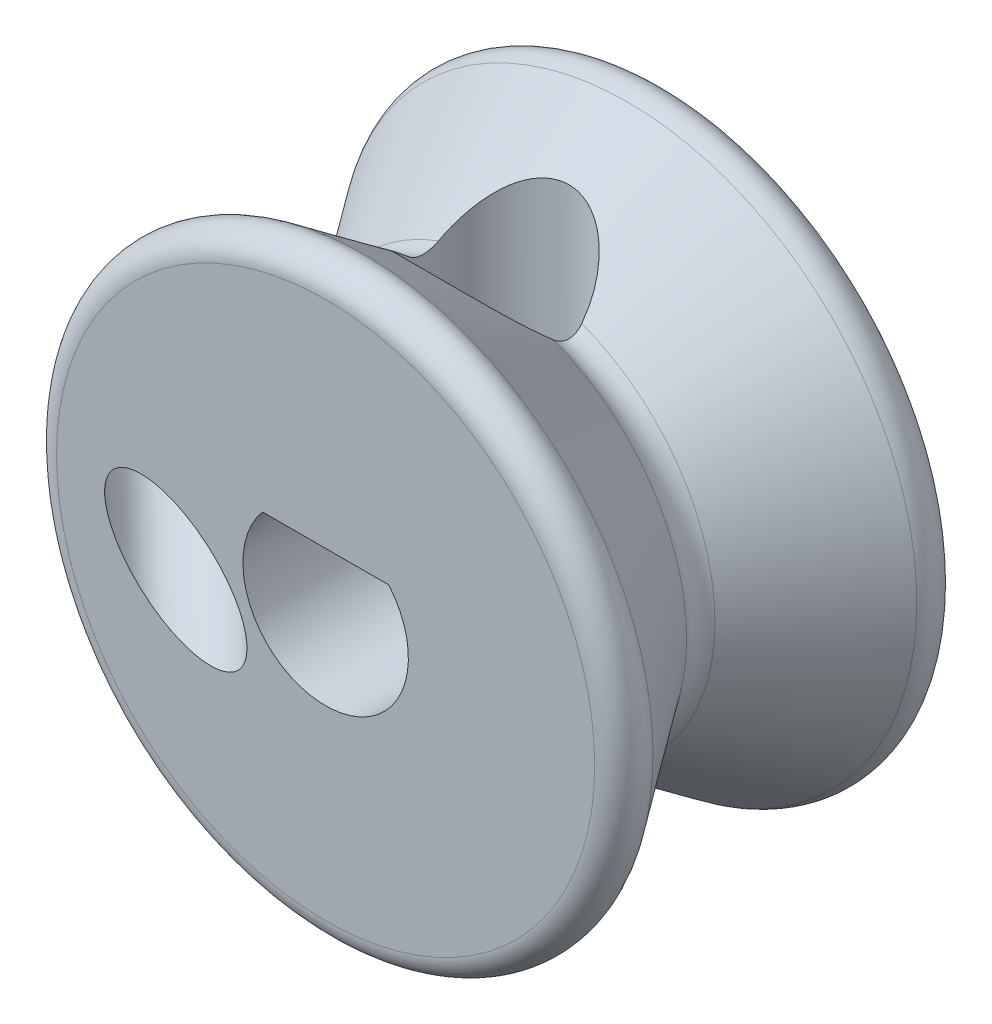
ISO-10303-21;
HEADER;
FILE_DESCRIPTION(('STEP AP214'),'2;1');
FILE_NAME('part.step','',(''),(''),'','','');
FILE_SCHEMA(('AUTOMOTIVE_DESIGN { 1 0 10303 214 1 1 1 1 }'));
ENDSEC;
DATA;
#1=APPLICATION_CONTEXT('core data for automotive mechanical design processes');
#2=APPLICATION_PROTOCOL_DEFINITION('international standard','automotive_design',2000,#1);
#3=PRODUCT_CONTEXT('',#1,'mechanical');
#4=PRODUCT('Part','Part','',(#3));
#5=PRODUCT_RELATED_PRODUCT_CATEGORY('part','',(#4));
#6=PRODUCT_DEFINITION_FORMATION('','',#4);
#7=PRODUCT_DEFINITION_CONTEXT('part definition',#1,'design');
#8=PRODUCT_DEFINITION('design','',#6,#7);
#9=PRODUCT_DEFINITION_SHAPE('','',#8);
#10=(LENGTH_UNIT() NAMED_UNIT(*) SI_UNIT(.MILLI.,.METRE.));
#11=(NAMED_UNIT(*) PLANE_ANGLE_UNIT() SI_UNIT($,.RADIAN.));
#12=(NAMED_UNIT(*) SI_UNIT($,.STERADIAN.) SOLID_ANGLE_UNIT());
#13=UNCERTAINTY_MEASURE_WITH_UNIT(LENGTH_MEASURE(1.E-05),#10,'distance_accuracy_value','');
#14=(GEOMETRIC_REPRESENTATION_CONTEXT(3) GLOBAL_UNCERTAINTY_ASSIGNED_CONTEXT((#13)) GLOBAL_UNIT_ASSIGNED_CONTEXT((#10,
#11,#12)) REPRESENTATION_CONTEXT('',''));
#15=CARTESIAN_POINT('',(0.,0.,0.));
#16=DIRECTION('',(0.,0.,1.));
#17=DIRECTION('',(1.,0.,0.));
#18=AXIS2_PLACEMENT_3D('',#15,#16,#17);
#19=CARTESIAN_POINT('',(0.,0.,-3.20938090314045));
#20=DIRECTION('',(0.,0.,1.));
#21=DIRECTION('',(1.,0.,0.));
#22=AXIS2_PLACEMENT_3D('',#19,#20,#21);
#23=CONICAL_SURFACE('',#22,4.20758506918539,0.620249485982821);
#24=CARTESIAN_POINT('',(-5.02656954580131,-0.227958123195677,-2.055569720891));
#25=CARTESIAN_POINT('',(-4.99379305476012,-0.21155060466564,-2.102451352586));
#26=CARTESIAN_POINT('',(-4.96203208182432,-0.189550428061586,-2.14818223013721));
#27=CARTESIAN_POINT('',(-4.90114036581584,-0.136146671985123,-2.23584987784017));
#28=CARTESIAN_POINT('',(-4.87201894340157,-0.104711340412993,-2.27777320391632));
#29=CARTESIAN_POINT('',(-4.81683589423341,-0.0344840006915252,-2.35643027532819));
#30=CARTESIAN_POINT('',(-4.790751746197,0.00424742477340337,-2.39320269166795));
#31=CARTESIAN_POINT('',(-4.74135798028501,0.0877574922217572,-2.46122207843588));
#32=CARTESIAN_POINT('',(-4.71804692125338,0.132532967095702,-2.49247192304468));
#33=CARTESIAN_POINT('',(-4.67091881420649,0.233836645937845,-2.55297597588142));
#34=CARTESIAN_POINT('',(-4.64751892760425,0.291127509368169,-2.58128305548753));
#35=CARTESIAN_POINT('',(-4.60427350990293,0.410598163993671,-2.62900404687573));
#36=CARTESIAN_POINT('',(-4.58443060640138,0.472781520954569,-2.64841140065061));
#37=CARTESIAN_POINT('',(-4.547532748472,0.604277882200499,-2.67822523843836));
#38=CARTESIAN_POINT('',(-4.53071137851703,0.67379507450545,-2.68803306498316));
#39=CARTESIAN_POINT('',(-4.50208164626001,0.814511826003525,-2.69554940906726));
#40=CARTESIAN_POINT('',(-4.49027044102892,0.885710406843049,-2.69326479819212));
#41=CARTESIAN_POINT('',(-4.47332531455615,1.02199216437818,-2.67664216752956));
#42=CARTESIAN_POINT('',(-4.46775520762294,1.08713179263033,-2.66322562657461));
#43=CARTESIAN_POINT('',(-4.4626784562076,1.21447268227432,-2.625614239523));
#44=CARTESIAN_POINT('',(-4.46316708193734,1.27667619768374,-2.60142781522395));
#45=CARTESIAN_POINT('',(-4.47059508112588,1.38929267705316,-2.54628701124487));
#46=CARTESIAN_POINT('',(-4.47682920685505,1.44025274720813,-2.51635093091189));
#47=CARTESIAN_POINT('',(-4.49515251842355,1.53632014929953,-2.44965394770889));
#48=CARTESIAN_POINT('',(-4.50723955205835,1.58142962486559,-2.41289555656954));
#49=CARTESIAN_POINT('',(-4.53642298703374,1.66173967291314,-2.3364646140575));
#50=CARTESIAN_POINT('',(-4.55315795961079,1.69738408030862,-2.29711908524838));
#51=CARTESIAN_POINT('',(-4.59168094596176,1.7612664306261,-2.21503702888793));
#52=CARTESIAN_POINT('',(-4.61346817988079,1.78950551518388,-2.1723010253512));
#53=CARTESIAN_POINT('',(-4.66116254312826,1.83731022673782,-2.08573956623527));
#54=CARTESIAN_POINT('',(-4.68697739437055,1.85703978511535,-2.04195364918528));
#55=CARTESIAN_POINT('',(-4.74237939217635,1.88812838461789,-1.95380241160695));
#56=CARTESIAN_POINT('',(-4.77196641822566,1.89948769307873,-1.90943710962955));
#57=CARTESIAN_POINT('',(-4.83401988470959,1.91353160538831,-1.8214366390448));
#58=CARTESIAN_POINT('',(-4.86648281726662,1.91622663175994,-1.77780065605552));
#59=CARTESIAN_POINT('',(-4.93330476897828,1.91291194621165,-1.69235370998233));
#60=CARTESIAN_POINT('',(-4.96766380296142,1.90690216620629,-1.65054276117572));
#61=CARTESIAN_POINT('',(-5.03746787583523,1.88627086112266,-1.56940349340774));
#62=CARTESIAN_POINT('',(-5.07291983806636,1.87157353434757,-1.53010044260879));
#63=CARTESIAN_POINT('',(-5.1434265322962,1.83395210532346,-1.4552644745015));
#64=CARTESIAN_POINT('',(-5.1784812397651,1.8110274978781,-1.41973178888615));
#65=CARTESIAN_POINT('',(-5.24777724163878,1.75705968985984,-1.35241357078308));
#66=CARTESIAN_POINT('',(-5.28198491428243,1.7258527537228,-1.32072486642555));
#67=CARTESIAN_POINT('',(-5.34766844244903,1.65651173673257,-1.26253273140002));
#68=CARTESIAN_POINT('',(-5.37914387968629,1.61837659797543,-1.23603009390551));
#69=CARTESIAN_POINT('',(-5.43962556408797,1.53460772719939,-1.18757377952116));
#70=CARTESIAN_POINT('',(-5.46847976677351,1.48873248939452,-1.16584835964459));
#71=CARTESIAN_POINT('',(-5.52139005049674,1.3919989770791,-1.12853405829326));
#72=CARTESIAN_POINT('',(-5.54544488485515,1.34113941294752,-1.11294677023253));
#73=CARTESIAN_POINT('',(-5.58947709019152,1.23257459631545,-1.08716133486924));
#74=CARTESIAN_POINT('',(-5.60911714292455,1.17464108979176,-1.07734897387022));
#75=CARTESIAN_POINT('',(-5.64192004673201,1.05624478011927,-1.06454180912837));
#76=CARTESIAN_POINT('',(-5.65508074736526,0.995781144456537,-1.06154926763072));
#77=CARTESIAN_POINT('',(-5.67537702694762,0.869702126560848,-1.06225101288597));
#78=CARTESIAN_POINT('',(-5.68204716446062,0.804014020287024,-1.06640918834775));
#79=CARTESIAN_POINT('',(-5.68771771407853,0.673182318942354,-1.08213672383129));
#80=CARTESIAN_POINT('',(-5.68671540400579,0.608038925342299,-1.09370871293316));
#81=CARTESIAN_POINT('',(-5.6769440983667,0.477524689776792,-1.12474093851196));
#82=CARTESIAN_POINT('',(-5.66787250333635,0.412244834322636,-1.1444923267873));
#83=CARTESIAN_POINT('',(-5.64178400445878,0.286213514851981,-1.1918226724759));
#84=CARTESIAN_POINT('',(-5.62476545821693,0.22546298992236,-1.21940324748323));
#85=CARTESIAN_POINT('',(-5.58401676842046,0.113087880855047,-1.28114561849191));
#86=CARTESIAN_POINT('',(-5.56056711430028,0.0612037432988303,-1.31501655427734));
#87=CARTESIAN_POINT('',(-5.50742243012832,-0.0335663109921794,-1.38974977501229));
#88=CARTESIAN_POINT('',(-5.47773604076562,-0.0764645147655947,-1.43060237275647));
#89=CARTESIAN_POINT('',(-5.4176956136018,-0.145462851031928,-1.51263084639314));
#90=CARTESIAN_POINT('',(-5.38797513391852,-0.173050335056198,-1.55301541444646));
#91=CARTESIAN_POINT('',(-5.32597517967485,-0.217679331047361,-1.63748272885507));
#92=CARTESIAN_POINT('',(-5.29369862765914,-0.234732696513312,-1.68156125490301));
#93=CARTESIAN_POINT('',(-5.23297187874344,-0.25556194788475,-1.76512363995377));
#94=CARTESIAN_POINT('',(-5.20466237865467,-0.260929380764024,-1.80432199627029));
#95=CARTESIAN_POINT('',(-5.14824700642852,-0.26316128437623,-1.88304518313133));
#96=CARTESIAN_POINT('',(-5.1201408959454,-0.260038256026964,-1.9225694483699));
#97=CARTESIAN_POINT('',(-5.08136357672897,-0.250035140653046,-1.97748426419822));
#98=CARTESIAN_POINT('',(-5.07026369514746,-0.246493718493076,-1.99324919439522));
#99=CARTESIAN_POINT('',(-5.04826241851123,-0.238155963786576,-2.02457418111574));
#100=CARTESIAN_POINT('',(-5.03736094094901,-0.233360166252345,-2.04013432202068));
#101=CARTESIAN_POINT('',(-5.02656954580131,-0.227958123195677,-2.055569720891));
#102=B_SPLINE_CURVE_WITH_KNOTS('',3,(#24,#25,#26,#27,#28,#29,#30,#31,#32,#33,#34,#35,#36,#37,
#38,#39,#40,#41,#42,#43,#44,#45,#46,#47,#48,#49,#50,#51,#52,#53,#54,#55,#56,#57,#58,#59,#60,#61,
#62,#63,#64,#65,#66,#67,#68,#69,#70,#71,#72,#73,#74,#75,#76,#77,#78,#79,#80,#81,#82,#83,#84,#85,
#86,#87,#88,#89,#90,#91,#92,#93,#94,#95,#96,#97,#98,#99,#100,#101),.UNSPECIFIED.,.T.,.F.,(4,2,2,
2,2,2,2,2,2,2,2,2,2,2,2,2,2,2,2,2,2,2,2,2,2,2,2,2,2,2,2,2,2,2,2,2,2,2,4),(0.,0.178445069534553,
0.357497524377954,0.535123998248637,0.712657753762048,0.915945675514906,1.11938315578985,
1.33482433303311,1.55014309794215,1.74923267346128,1.94816683823018,2.12552910458004,
2.30282620155683,2.46901155914158,2.63517128180965,2.79796905796852,2.96076163433456,
3.12335830924696,3.28595625593107,3.44999431191754,3.61404244238797,3.78161261073706,
3.94920838780142,4.12360563509971,4.29804812484796,4.4831088321747,4.66823091822146,
4.86581984331675,5.06347887603716,5.26887805929415,5.47431971115543,5.67193215612231,
5.86927260328559,6.03991779719169,6.21037062141844,6.35559607729465,6.50060782653468,
6.5593844539717,6.61813605294816),.UNSPECIFIED.);
#103=CARTESIAN_POINT('',(-5.02656954580131,-0.227958123195677,-2.055569720891));
#104=VERTEX_POINT('',#103);
#105=EDGE_CURVE('E105',#104,#104,#102,.T.);
#106=ORIENTED_EDGE('',*,*,#105,.T.);
#107=EDGE_LOOP('',(#106));
#108=FACE_BOUND('',#107,.T.);
#109=CARTESIAN_POINT('',(0.,0.,-0.790619096859548));
#110=DIRECTION('',(0.,0.,1.));
#111=DIRECTION('',(1.,0.,0.));
#112=AXIS2_PLACEMENT_3D('',#109,#110,#111);
#113=CIRCLE('',#112,5.93527207367175);
#114=CARTESIAN_POINT('',(5.93527207367175,0.,-0.790619096859548));
#115=VERTEX_POINT('',#114);
#116=EDGE_CURVE('E131',#115,#115,#113,.T.);
#117=ORIENTED_EDGE('',*,*,#116,.F.);
#118=EDGE_LOOP('',(#117));
#119=FACE_BOUND('',#118,.T.);
#120=CARTESIAN_POINT('',(-1.4903946418383,3.84211422423038,-3.3305189934545));
#121=CARTESIAN_POINT('',(-1.48481683397136,3.88176759578318,-3.28158336747033));
#122=CARTESIAN_POINT('',(-1.47688669498239,3.92176252377707,-3.23320397281078));
#123=CARTESIAN_POINT('',(-1.45641039667193,4.00208865130841,-3.13769494030213));
#124=CARTESIAN_POINT('',(-1.44386305429472,4.0424199344386,-3.09056562607932));
#125=CARTESIAN_POINT('',(-1.41413025885452,4.12336071399282,-2.99736292819548));
#126=CARTESIAN_POINT('',(-1.39690994061002,4.16396996944362,-2.95130042770154));
#127=CARTESIAN_POINT('',(-1.35788745206112,4.24477329693781,-2.8608059215605));
#128=CARTESIAN_POINT('',(-1.3360858443179,4.28496741932242,-2.8163737165068));
#129=CARTESIAN_POINT('',(-1.2686872871043,4.39619275034575,-2.6947582044622));
#130=CARTESIAN_POINT('',(-1.21793746534054,4.46638063993726,-2.61956859696947));
#131=CARTESIAN_POINT('',(-1.10093760213554,4.60136432754813,-2.47706109397592));
#132=CARTESIAN_POINT('',(-1.03473205220265,4.66617489246736,-2.40972142023843));
#133=CARTESIAN_POINT('',(-0.907298279407148,4.76947910202508,-2.30351440328544));
#134=CARTESIAN_POINT('',(-0.850075216831733,4.81019377642384,-2.26201616745171));
#135=CARTESIAN_POINT('',(-0.727235334350097,4.88511074815673,-2.18610384569413));
#136=CARTESIAN_POINT('',(-0.66162991143781,4.91932173388483,-2.15168030350125));
#137=CARTESIAN_POINT('',(-0.535905634001361,4.97322343590727,-2.09766219058843));
#138=CARTESIAN_POINT('',(-0.477125223257947,4.99443895059349,-2.07649169482775));
#139=CARTESIAN_POINT('',(-0.355394664841275,5.02974328278488,-2.0413371358503));
#140=CARTESIAN_POINT('',(-0.292447485985086,5.04383711396212,-2.02734801682653));
#141=CARTESIAN_POINT('',(-0.163581217246617,5.06383583623437,-2.00751490093575));
#142=CARTESIAN_POINT('',(-0.0976466363022072,5.06969136621771,-2.00172000001272));
#143=CARTESIAN_POINT('',(0.0345933687735502,5.07249642836357,-1.9989426919682));
#144=CARTESIAN_POINT('',(0.100898695954988,5.06944818926554,-2.00195807950684));
#145=CARTESIAN_POINT('',(0.225301993357118,5.05545677301523,-2.01582283617414));
#146=CARTESIAN_POINT('',(0.283579619678831,5.0452942680691,-2.02589764536863));
#147=CARTESIAN_POINT('',(0.397164926574301,5.01866847573151,-2.05235854891626));
#148=CARTESIAN_POINT('',(0.452471487944854,5.00220283265944,-2.06874700289132));
#149=CARTESIAN_POINT('',(0.576548323279925,4.95769618169769,-2.11319404744918));
#150=CARTESIAN_POINT('',(0.643852987160708,4.92763238083197,-2.14331438210907));
#151=CARTESIAN_POINT('',(0.770645182144741,4.86040276646358,-2.21108644122083));
#152=CARTESIAN_POINT('',(0.830119413861774,4.82322512676327,-2.24875071181801));
#153=CARTESIAN_POINT('',(0.9612388961148,4.72927828429418,-2.34466235051368));
#154=CARTESIAN_POINT('',(1.02945349140229,4.6702990416972,-2.40541580675302));
#155=CARTESIAN_POINT('',(1.15174264989936,4.54633524392376,-2.53487946251277));
#156=CARTESIAN_POINT('',(1.20576510488687,4.48132971196108,-2.60361768337751));
#157=CARTESIAN_POINT('',(1.28592466688931,4.36814844707447,-2.72540864063627));
#158=CARTESIAN_POINT('',(1.31556288742079,4.32078630855159,-2.7769667112105));
#159=CARTESIAN_POINT('',(1.36831203711194,4.22514990043654,-2.88257986173841));
#160=CARTESIAN_POINT('',(1.39141952978492,4.17687516483386,-2.93663623896619));
#161=CARTESIAN_POINT('',(1.43092760148633,4.08056563389157,-3.04633037796216));
#162=CARTESIAN_POINT('',(1.4473923772709,4.0325332017811,-3.10194715918717));
#163=CARTESIAN_POINT('',(1.47380225420583,3.93687838482539,-3.21495550764059));
#164=CARTESIAN_POINT('',(1.48375347570681,3.88925565666161,-3.27234535557209));
#165=CARTESIAN_POINT('',(1.4903946418383,3.84211422423038,-3.3305189934545));
#166=B_SPLINE_CURVE_WITH_KNOTS('',3,(#120,#121,#122,#123,#124,#125,#126,#127,#128,#129,#130,
#131,#132,#133,#134,#135,#136,#137,#138,#139,#140,#141,#142,#143,#144,#145,#146,#147,#148,#149,
#150,#151,#152,#153,#154,#155,#156,#157,#158,#159,#160,#161,#162,#163,#164,#165),.UNSPECIFIED.,
.F.,.F.,(4,2,2,2,2,2,2,2,2,2,2,2,2,2,2,2,2,2,2,2,2,2,4),(0.,0.189633167919007,0.379314958993021,
0.570452847576023,0.761567279011214,1.10435785715169,1.44617357358257,1.69009161735787,
1.93368148086201,2.13083255822683,2.32784464699358,2.52603221010094,2.72417016830755,
2.90341154820765,3.0827199817428,3.32030015630686,3.55827877561885,3.8827347069829,
4.20836577619317,4.43613104589551,4.66401594409947,4.88964248163327,5.11505670751473),.UNSPECIFIED.);
#167=CARTESIAN_POINT('',(-1.47157756864548,3.94185636139767,-3.20938090314045));
#168=VERTEX_POINT('',#167);
#169=CARTESIAN_POINT('',(1.47157756864548,3.94185636139767,-3.20938090314045));
#170=VERTEX_POINT('',#169);
#171=EDGE_CURVE('E150',#168,#170,#166,.T.);
#172=ORIENTED_EDGE('',*,*,#171,.F.);
#173=CARTESIAN_POINT('',(0.,0.,-3.20938090314045));
#174=DIRECTION('',(0.,0.,1.));
#175=DIRECTION('',(1.,0.,0.));
#176=AXIS2_PLACEMENT_3D('',#173,#174,#175);
#177=CIRCLE('',#176,4.20758506918539);
#178=EDGE_CURVE('E128',#168,#170,#177,.T.);
#179=ORIENTED_EDGE('',*,*,#178,.T.);
#180=EDGE_LOOP('',(#172,#179));
#181=FACE_BOUND('',#180,.T.);
#182=ADVANCED_FACE('F39',(#108,#119,#181),#23,.T.);
#183=CARTESIAN_POINT('',(0.,0.,-3.5));
#184=DIRECTION('',(0.,0.,1.));
#185=DIRECTION('',(1.,0.,0.));
#186=AXIS2_PLACEMENT_3D('',#183,#184,#185);
#187=TOROIDAL_SURFACE('',#186,4.61445180478876,0.5);
#188=CARTESIAN_POINT('',(1.4715380568989,3.94202367750988,-3.20918090314045));
#189=CARTESIAN_POINT('',(1.47541277471455,3.92562728180173,-3.22874780946187));
#190=CARTESIAN_POINT('',(1.47911787875578,3.91060465302931,-3.24958466455607));
#191=CARTESIAN_POINT('',(1.48589041142091,3.88386638703308,-3.29355016562411));
#192=CARTESIAN_POINT('',(1.48895364451283,3.87217233908932,-3.31669251507996));
#193=CARTESIAN_POINT('',(1.49410025186259,3.852824127086,-3.36489036157781));
#194=CARTESIAN_POINT('',(1.49617833897684,3.84519173516656,-3.38995536115748));
#195=CARTESIAN_POINT('',(1.49905869103933,3.83467127749939,-3.44106192818164));
#196=CARTESIAN_POINT('',(1.4998653126474,3.83176700976902,-3.46709984652392));
#197=CARTESIAN_POINT('',(1.5000915358284,3.83095073423236,-3.51660291285824));
#198=CARTESIAN_POINT('',(1.49964371767759,3.83256154469634,-3.54006070869494));
#199=CARTESIAN_POINT('',(1.49769153968382,3.83965710662299,-3.5863566786431));
#200=CARTESIAN_POINT('',(1.4961860488989,3.84514600486018,-3.60919416229643));
#201=CARTESIAN_POINT('',(1.49231938874626,3.85949245651555,-3.65317085947942));
#202=CARTESIAN_POINT('',(1.48997631528716,3.86827895206551,-3.6743352249841));
#203=CARTESIAN_POINT('',(1.48464247091536,3.88877331118938,-3.715078535361));
#204=CARTESIAN_POINT('',(1.48165207151411,3.90047949968555,-3.73465838079785));
#205=CARTESIAN_POINT('',(1.47623524217755,3.92238781431803,-3.7662762386147));
#206=CARTESIAN_POINT('',(1.4739179690415,3.93194636615912,-3.77878261541557));
#207=CARTESIAN_POINT('',(1.4715380568989,3.94202367750987,-3.79081909685955));
#208=B_SPLINE_CURVE_WITH_KNOTS('',3,(#188,#189,#190,#191,#192,#193,#194,#195,#196,#197,#198,
#199,#200,#201,#202,#203,#204,#205,#206,#207),.UNSPECIFIED.,.F.,.F.,(4,2,2,2,2,2,2,2,2,4),(0.,
0.077495938803986,0.15548362528424,0.233885250893445,0.312017645814018,0.38221271945421,
0.452482965332966,0.521318660720922,0.590114954372545,0.637766293701074),.UNSPECIFIED.);
#209=CARTESIAN_POINT('',(1.47157756864548,3.94185636139767,-3.79061909685955));
#210=VERTEX_POINT('',#209);
#211=EDGE_CURVE('E55',#170,#210,#208,.T.);
#212=ORIENTED_EDGE('',*,*,#211,.F.);
#213=ORIENTED_EDGE('',*,*,#178,.F.);
#214=CARTESIAN_POINT('',(-1.4715380568989,3.94202367750988,-3.79081909685955));
#215=CARTESIAN_POINT('',(-1.47541277471455,3.92562728180173,-3.77125219053813));
#216=CARTESIAN_POINT('',(-1.47911787875578,3.91060465302931,-3.75041533544393));
#217=CARTESIAN_POINT('',(-1.48589041142091,3.88386638703308,-3.70644983437589));
#218=CARTESIAN_POINT('',(-1.48895364451283,3.87217233908932,-3.68330748492004));
#219=CARTESIAN_POINT('',(-1.49410025186259,3.852824127086,-3.63510963842219));
#220=CARTESIAN_POINT('',(-1.49617833897685,3.84519173516656,-3.61004463884252));
#221=CARTESIAN_POINT('',(-1.49905869103934,3.83467127749939,-3.55893807181836));
#222=CARTESIAN_POINT('',(-1.4998653126474,3.83176700976902,-3.53290015347608));
#223=CARTESIAN_POINT('',(-1.50009153582841,3.83095073423236,-3.48339708714176));
#224=CARTESIAN_POINT('',(-1.49964371767759,3.83256154469634,-3.45993929130506));
#225=CARTESIAN_POINT('',(-1.49769153968382,3.83965710662299,-3.4136433213569));
#226=CARTESIAN_POINT('',(-1.4961860488989,3.84514600486018,-3.39080583770357));
#227=CARTESIAN_POINT('',(-1.49231938874626,3.85949245651555,-3.34682914052058));
#228=CARTESIAN_POINT('',(-1.48997631528717,3.86827895206551,-3.3256647750159));
#229=CARTESIAN_POINT('',(-1.48464247091536,3.88877331118938,-3.284921464639));
#230=CARTESIAN_POINT('',(-1.48165207151411,3.90047949968555,-3.26534161920215));
#231=CARTESIAN_POINT('',(-1.47623524217755,3.92238781431803,-3.2337237613853));
#232=CARTESIAN_POINT('',(-1.4739179690415,3.93194636615912,-3.22121738458443));
#233=CARTESIAN_POINT('',(-1.4715380568989,3.94202367750987,-3.20918090314045));
#234=B_SPLINE_CURVE_WITH_KNOTS('',3,(#214,#215,#216,#217,#218,#219,#220,#221,#222,#223,#224,
#225,#226,#227,#228,#229,#230,#231,#232,#233),.UNSPECIFIED.,.F.,.F.,(4,2,2,2,2,2,2,2,2,4),(0.,
0.0774959388039857,0.155483625284239,0.233885250893445,0.312017645814018,0.38221271945421,
0.452482965332966,0.521318660720922,0.590114954372545,0.637766293701074),.UNSPECIFIED.);
#235=CARTESIAN_POINT('',(-1.47157756864666,3.94185636139731,-3.79061909685965));
#236=VERTEX_POINT('',#235);
#237=EDGE_CURVE('E156',#236,#168,#234,.T.);
#238=ORIENTED_EDGE('',*,*,#237,.F.);
#239=CARTESIAN_POINT('',(0.,0.,-3.79061909685955));
#240=DIRECTION('',(0.,0.,1.));
#241=DIRECTION('',(1.,0.,0.));
#242=AXIS2_PLACEMENT_3D('',#239,#240,#241);
#243=CIRCLE('',#242,4.20758506918539);
#244=EDGE_CURVE('E125',#236,#210,#243,.T.);
#245=ORIENTED_EDGE('',*,*,#244,.T.);
#246=EDGE_LOOP('',(#212,#213,#238,#245));
#247=FACE_BOUND('',#246,.T.);
#248=ADVANCED_FACE('F146',(#247),#187,.F.);
#249=CARTESIAN_POINT('',(0.,0.,-6.20938090314045));
#250=DIRECTION('',(0.,0.,-1.));
#251=DIRECTION('',(-1.,0.,0.));
#252=AXIS2_PLACEMENT_3D('',#249,#250,#251);
#253=CONICAL_SURFACE('',#252,5.93527207367175,0.620249485982822);
#254=CARTESIAN_POINT('',(0.,0.,-6.20938090314045));
#255=DIRECTION('',(0.,0.,1.));
#256=DIRECTION('',(1.,0.,0.));
#257=AXIS2_PLACEMENT_3D('',#254,#255,#256);
#258=CIRCLE('',#257,5.93527207367175);
#259=CARTESIAN_POINT('',(5.93527207367175,0.,-6.20938090314045));
#260=VERTEX_POINT('',#259);
#261=EDGE_CURVE('E122',#260,#260,#258,.T.);
#262=ORIENTED_EDGE('',*,*,#261,.T.);
#263=EDGE_LOOP('',(#262));
#264=FACE_BOUND('',#263,.T.);
#265=CARTESIAN_POINT('',(1.4903946418383,3.84211422423038,-3.6694810065455));
#266=CARTESIAN_POINT('',(1.48481683397136,3.88176759578318,-3.71841663252966));
#267=CARTESIAN_POINT('',(1.47688669498239,3.92176252377707,-3.76679602718922));
#268=CARTESIAN_POINT('',(1.45641039667193,4.00208865130841,-3.86230505969787));
#269=CARTESIAN_POINT('',(1.44386305429471,4.0424199344386,-3.90943437392068));
#270=CARTESIAN_POINT('',(1.41413025885451,4.12336071399282,-4.00263707180452));
#271=CARTESIAN_POINT('',(1.39690994061002,4.16396996944362,-4.04869957229846));
#272=CARTESIAN_POINT('',(1.35788745206112,4.24477329693781,-4.1391940784395));
#273=CARTESIAN_POINT('',(1.33608584431789,4.28496741932242,-4.1836262834932));
#274=CARTESIAN_POINT('',(1.26868728710429,4.39619275034575,-4.3052417955378));
#275=CARTESIAN_POINT('',(1.21793746534054,4.46638063993726,-4.38043140303053));
#276=CARTESIAN_POINT('',(1.10093760213554,4.60136432754814,-4.52293890602408));
#277=CARTESIAN_POINT('',(1.03473205220265,4.66617489246737,-4.59027857976157));
#278=CARTESIAN_POINT('',(0.907298279407146,4.76947910202508,-4.69648559671457));
#279=CARTESIAN_POINT('',(0.850075216831731,4.81019377642384,-4.73798383254829));
#280=CARTESIAN_POINT('',(0.727235334350095,4.88511074815673,-4.81389615430587));
#281=CARTESIAN_POINT('',(0.661629911437808,4.91932173388483,-4.84831969649875));
#282=CARTESIAN_POINT('',(0.535905634001359,4.97322343590727,-4.90233780941157));
#283=CARTESIAN_POINT('',(0.477125223257945,4.99443895059349,-4.92350830517225));
#284=CARTESIAN_POINT('',(0.355394664841274,5.02974328278488,-4.9586628641497));
#285=CARTESIAN_POINT('',(0.292447485985084,5.04383711396212,-4.97265198317347));
#286=CARTESIAN_POINT('',(0.163581217246616,5.06383583623437,-4.99248509906425));
#287=CARTESIAN_POINT('',(0.0976466363022058,5.06969136621771,-4.99827999998728));
#288=CARTESIAN_POINT('',(-0.0345933687735517,5.07249642836357,-5.0010573080318));
#289=CARTESIAN_POINT('',(-0.100898695954989,5.06944818926554,-4.99804192049316));
#290=CARTESIAN_POINT('',(-0.22530199335712,5.05545677301523,-4.98417716382586));
#291=CARTESIAN_POINT('',(-0.283579619678833,5.0452942680691,-4.97410235463137));
#292=CARTESIAN_POINT('',(-0.397164926574303,5.01866847573152,-4.94764145108374));
#293=CARTESIAN_POINT('',(-0.452471487944856,5.00220283265944,-4.93125299710868));
#294=CARTESIAN_POINT('',(-0.576548323279927,4.95769618169769,-4.88680595255082));
#295=CARTESIAN_POINT('',(-0.64385298716071,4.92763238083198,-4.85668561789093));
#296=CARTESIAN_POINT('',(-0.770645182144743,4.86040276646358,-4.78891355877917));
#297=CARTESIAN_POINT('',(-0.830119413861775,4.82322512676327,-4.75124928818199));
#298=CARTESIAN_POINT('',(-0.961238896114801,4.72927828429418,-4.65533764948632));
#299=CARTESIAN_POINT('',(-1.02945349140229,4.6702990416972,-4.59458419324698));
#300=CARTESIAN_POINT('',(-1.15174264989936,4.54633524392376,-4.46512053748724));
#301=CARTESIAN_POINT('',(-1.20576510488687,4.48132971196108,-4.3963823166225));
#302=CARTESIAN_POINT('',(-1.28592466688931,4.36814844707447,-4.27459135936373));
#303=CARTESIAN_POINT('',(-1.31556288742079,4.32078630855159,-4.2230332887895));
#304=CARTESIAN_POINT('',(-1.36831203711194,4.22514990043654,-4.11742013826159));
#305=CARTESIAN_POINT('',(-1.39141952978492,4.17687516483386,-4.06336376103381));
#306=CARTESIAN_POINT('',(-1.43092760148633,4.08056563389157,-3.95366962203784));
#307=CARTESIAN_POINT('',(-1.44739237727091,4.0325332017811,-3.89805284081283));
#308=CARTESIAN_POINT('',(-1.47380225420583,3.93687838482539,-3.78504449235941));
#309=CARTESIAN_POINT('',(-1.48375347570681,3.88925565666161,-3.72765464442791));
#310=CARTESIAN_POINT('',(-1.49039464183831,3.84211422423038,-3.6694810065455));
#311=B_SPLINE_CURVE_WITH_KNOTS('',3,(#265,#266,#267,#268,#269,#270,#271,#272,#273,#274,#275,
#276,#277,#278,#279,#280,#281,#282,#283,#284,#285,#286,#287,#288,#289,#290,#291,#292,#293,#294,
#295,#296,#297,#298,#299,#300,#301,#302,#303,#304,#305,#306,#307,#308,#309,#310),.UNSPECIFIED.,
.F.,.F.,(4,2,2,2,2,2,2,2,2,2,2,2,2,2,2,2,2,2,2,2,2,2,4),(0.,0.189633167919006,0.37931495899302,
0.570452847576022,0.761567279011213,1.10435785715169,1.44617357358257,1.69009161735787,
1.93368148086201,2.13083255822683,2.32784464699358,2.52603221010094,2.72417016830755,
2.90341154820765,3.0827199817428,3.32030015630686,3.55827877561885,3.8827347069829,
4.20836577619317,4.43613104589551,4.66401594409947,4.88964248163328,5.11505670751473),.UNSPECIFIED.);
#312=EDGE_CURVE('E159',#210,#236,#311,.T.);
#313=ORIENTED_EDGE('',*,*,#312,.F.);
#314=ORIENTED_EDGE('',*,*,#244,.F.);
#315=EDGE_LOOP('',(#313,#314));
#316=FACE_BOUND('',#315,.T.);
#317=ADVANCED_FACE('F205',(#264,#316),#253,.T.);
#318=CARTESIAN_POINT('',(0.,0.,-7.));
#319=DIRECTION('',(0.,0.,1.));
#320=DIRECTION('',(1.,0.,0.));
#321=AXIS2_PLACEMENT_3D('',#318,#319,#320);
#322=CYLINDRICAL_SURFACE('',#321,1.7);
#323=CARTESIAN_POINT('',(1.29614813968157,1.1,-4.25498344352707));
#324=CARTESIAN_POINT('',(1.31101080670027,1.08248866542249,-4.22945761293178));
#325=CARTESIAN_POINT('',(1.32515689486175,1.06509712106422,-4.20344909234539));
#326=CARTESIAN_POINT('',(1.35201969729247,1.03078586705107,-4.1503328347894));
#327=CARTESIAN_POINT('',(1.36473401859239,1.01386698183415,-4.12322335767452));
#328=CARTESIAN_POINT('',(1.40112656067637,0.963618227368112,-4.03910362907977));
#329=CARTESIAN_POINT('',(1.42247799477244,0.931493028344641,-3.98027958442205));
#330=CARTESIAN_POINT('',(1.45309356129372,0.882666912069148,-3.87495905022334));
#331=CARTESIAN_POINT('',(1.46406778576548,0.864189489438926,-3.82979897104844));
#332=CARTESIAN_POINT('',(1.48191813890784,0.833210550306486,-3.7369171597923));
#333=CARTESIAN_POINT('',(1.488821490969,0.820669449508278,-3.68921482566903));
#334=CARTESIAN_POINT('',(1.49719462829074,0.805279212761253,-3.60023092564252));
#335=CARTESIAN_POINT('',(1.49939298610391,0.801137190644114,-3.55925044979402));
#336=CARTESIAN_POINT('',(1.50038658139976,0.799276051327747,-3.47711642910769));
#337=CARTESIAN_POINT('',(1.49918407152635,0.801552682580865,-3.43596301685057));
#338=CARTESIAN_POINT('',(1.49352459768349,0.812044193477186,-3.35500388585101));
#339=CARTESIAN_POINT('',(1.48909138719331,0.820215726901049,-3.31519053757735));
#340=CARTESIAN_POINT('',(1.47730737791177,0.841253002983441,-3.23706124221259));
#341=CARTESIAN_POINT('',(1.46993861236698,0.854147612828303,-3.19875614291482));
#342=CARTESIAN_POINT('',(1.4522847686555,0.883842864141142,-3.12255904270553));
#343=CARTESIAN_POINT('',(1.44189342453434,0.900780847917726,-3.08474696944503));
#344=CARTESIAN_POINT('',(1.4185925657298,0.937049368612332,-3.01102966002098));
#345=CARTESIAN_POINT('',(1.40567813517707,0.956384548807606,-2.97512832325502));
#346=CARTESIAN_POINT('',(1.37783239047008,0.996067633199034,-2.90591243740948));
#347=CARTESIAN_POINT('',(1.36295308970774,1.0163828933891,-2.8725578249828));
#348=CARTESIAN_POINT('',(1.33110408769197,1.05775689427267,-2.80757247183598));
#349=CARTESIAN_POINT('',(1.31414364108232,1.07881206617712,-2.77593494115246));
#350=CARTESIAN_POINT('',(1.2961481396816,1.09999999999997,-2.74501655647291));
#351=B_SPLINE_CURVE_WITH_KNOTS('',3,(#323,#324,#325,#326,#327,#328,#329,#330,#331,#332,#333,
#334,#335,#336,#337,#338,#339,#340,#341,#342,#343,#344,#345,#346,#347,#348,#349,#350),
.UNSPECIFIED.,.F.,.F.,(4,2,2,2,2,2,2,2,2,2,2,2,2,4),(0.,0.102975090693296,0.206119810504301,
0.416384505657861,0.566018468656485,0.714640081732939,0.837784771232632,0.960847912086624,
1.0830152539852,1.20594208700414,1.33386028191502,1.46203023819656,1.58731165601112,
1.71205488311922),.UNSPECIFIED.);
#352=CARTESIAN_POINT('',(1.29614813968157,1.1,-4.25498344352707));
#353=VERTEX_POINT('',#352);
#354=CARTESIAN_POINT('',(1.29614813968157,1.1,-2.74501655647293));
#355=VERTEX_POINT('',#354);
#356=EDGE_CURVE('E62',#353,#355,#351,.T.);
#357=ORIENTED_EDGE('',*,*,#356,.F.);
#358=DIRECTION('',(0.,0.,1.));
#359=VECTOR('',#358,1.);
#360=CARTESIAN_POINT('',(1.29614813968157,1.1,-7.));
#361=LINE('',#360,#359);
#362=CARTESIAN_POINT('',(1.29614813968157,1.1,-7.));
#363=VERTEX_POINT('',#362);
#364=EDGE_CURVE('E111',#363,#353,#361,.T.);
#365=ORIENTED_EDGE('',*,*,#364,.F.);
#366=CARTESIAN_POINT('',(0.,0.,-7.));
#367=DIRECTION('',(0.,0.,1.));
#368=DIRECTION('',(1.,0.,0.));
#369=AXIS2_PLACEMENT_3D('',#366,#367,#368);
#370=CIRCLE('',#369,1.7);
#371=CARTESIAN_POINT('',(-1.29614813968157,1.1,-7.));
#372=VERTEX_POINT('',#371);
#373=EDGE_CURVE('E272',#372,#363,#370,.T.);
#374=ORIENTED_EDGE('',*,*,#373,.F.);
#375=DIRECTION('',(0.,0.,1.));
#376=VECTOR('',#375,1.);
#377=CARTESIAN_POINT('',(-1.29614813968157,1.1,-7.));
#378=LINE('',#377,#376);
#379=CARTESIAN_POINT('',(-1.29614813968157,1.1,-4.25498344352708));
#380=VERTEX_POINT('',#379);
#381=EDGE_CURVE('E104',#372,#380,#378,.T.);
#382=ORIENTED_EDGE('',*,*,#381,.T.);
#383=CARTESIAN_POINT('',(-1.29614813968157,1.1,-2.74501655647292));
#384=CARTESIAN_POINT('',(-1.31101080670027,1.08248866542249,-2.77054238706822));
#385=CARTESIAN_POINT('',(-1.32515689486175,1.06509712106422,-2.79655090765461));
#386=CARTESIAN_POINT('',(-1.35201969729247,1.03078586705106,-2.8496671652106));
#387=CARTESIAN_POINT('',(-1.36473401859239,1.01386698183415,-2.87677664232548));
#388=CARTESIAN_POINT('',(-1.40112656067637,0.96361822736811,-2.96089637092022));
#389=CARTESIAN_POINT('',(-1.42247799477244,0.93149302834464,-3.01972041557794));
#390=CARTESIAN_POINT('',(-1.45309356129372,0.882666912069145,-3.12504094977666));
#391=CARTESIAN_POINT('',(-1.46406778576548,0.864189489438924,-3.17020102895155));
#392=CARTESIAN_POINT('',(-1.48191813890784,0.833210550306483,-3.26308284020769));
#393=CARTESIAN_POINT('',(-1.488821490969,0.820669449508275,-3.31078517433097));
#394=CARTESIAN_POINT('',(-1.49719462829074,0.80527921276125,-3.39976907435748));
#395=CARTESIAN_POINT('',(-1.49939298610391,0.801137190644111,-3.44074955020598));
#396=CARTESIAN_POINT('',(-1.50038658139976,0.799276051327744,-3.52288357089231));
#397=CARTESIAN_POINT('',(-1.49918407152635,0.801552682580861,-3.56403698314943));
#398=CARTESIAN_POINT('',(-1.49352459768349,0.812044193477182,-3.64499611414899));
#399=CARTESIAN_POINT('',(-1.48909138719331,0.820215726901045,-3.68480946242265));
#400=CARTESIAN_POINT('',(-1.47730737791177,0.841253002983438,-3.7629387577874));
#401=CARTESIAN_POINT('',(-1.46993861236698,0.854147612828298,-3.80124385708518));
#402=CARTESIAN_POINT('',(-1.45228476865551,0.883842864141137,-3.87744095729446));
#403=CARTESIAN_POINT('',(-1.44189342453434,0.900780847917722,-3.91525303055497));
#404=CARTESIAN_POINT('',(-1.4185925657298,0.937049368612329,-3.98897033997902));
#405=CARTESIAN_POINT('',(-1.40567813517707,0.956384548807604,-4.02487167674498));
#406=CARTESIAN_POINT('',(-1.37783239047008,0.996067633199032,-4.09408756259052));
#407=CARTESIAN_POINT('',(-1.36295308970774,1.0163828933891,-4.12744217501721));
#408=CARTESIAN_POINT('',(-1.33110408769197,1.05775689427267,-4.19242752816402));
#409=CARTESIAN_POINT('',(-1.31414364108232,1.07881206617712,-4.22406505884754));
#410=CARTESIAN_POINT('',(-1.2961481396816,1.09999999999997,-4.2549834435271));
#411=B_SPLINE_CURVE_WITH_KNOTS('',3,(#383,#384,#385,#386,#387,#388,#389,#390,#391,#392,#393,
#394,#395,#396,#397,#398,#399,#400,#401,#402,#403,#404,#405,#406,#407,#408,#409,#410),
.UNSPECIFIED.,.F.,.F.,(4,2,2,2,2,2,2,2,2,2,2,2,2,4),(0.,0.102975090693296,0.206119810504302,
0.416384505657863,0.566018468656487,0.71464008173294,0.837784771232633,0.960847912086624,
1.0830152539852,1.20594208700414,1.33386028191502,1.46203023819656,1.58731165601113,
1.71205488311923),.UNSPECIFIED.);
#412=CARTESIAN_POINT('',(-1.29614813968157,1.1,-2.74501655647292));
#413=VERTEX_POINT('',#412);
#414=EDGE_CURVE('E91',#413,#380,#411,.T.);
#415=ORIENTED_EDGE('',*,*,#414,.F.);
#416=CARTESIAN_POINT('',(-1.29614813968157,1.1,0.));
#417=VERTEX_POINT('',#416);
#418=EDGE_CURVE('E101',#413,#417,#378,.T.);
#419=ORIENTED_EDGE('',*,*,#418,.T.);
#420=CARTESIAN_POINT('',(0.,0.,0.));
#421=DIRECTION('',(0.,0.,1.));
#422=DIRECTION('',(1.,0.,0.));
#423=AXIS2_PLACEMENT_3D('',#420,#421,#422);
#424=CIRCLE('',#423,1.7);
#425=CARTESIAN_POINT('',(1.29614813968157,1.1,0.));
#426=VERTEX_POINT('',#425);
#427=EDGE_CURVE('E152',#417,#426,#424,.T.);
#428=ORIENTED_EDGE('',*,*,#427,.T.);
#429=EDGE_CURVE('E115',#355,#426,#361,.T.);
#430=ORIENTED_EDGE('',*,*,#429,.F.);
#431=EDGE_LOOP('',(#357,#365,#374,#382,#415,#419,#428,#430));
#432=FACE_BOUND('',#431,.T.);
#433=ADVANCED_FACE('F99',(#432),#322,.F.);
#434=CARTESIAN_POINT('',(-1.29614813968157,1.1,-7.));
#435=DIRECTION('',(0.,1.,0.));
#436=DIRECTION('',(0.,0.,1.));
#437=AXIS2_PLACEMENT_3D('',#434,#435,#436);
#438=PLANE('',#437);
#439=CARTESIAN_POINT('',(0.,1.1,-3.5));
#440=DIRECTION('',(0.,1.,0.));
#441=DIRECTION('',(0.,0.,1.));
#442=AXIS2_PLACEMENT_3D('',#439,#440,#441);
#443=CIRCLE('',#442,1.5);
#444=EDGE_CURVE('E11',#380,#353,#443,.F.);
#445=ORIENTED_EDGE('',*,*,#444,.F.);
#446=ORIENTED_EDGE('',*,*,#381,.F.);
#447=DIRECTION('',(-1.,0.,0.));
#448=VECTOR('',#447,1.);
#449=CARTESIAN_POINT('',(-1.29614813968157,1.1,-7.));
#450=LINE('',#449,#448);
#451=EDGE_CURVE('E274',#363,#372,#450,.T.);
#452=ORIENTED_EDGE('',*,*,#451,.F.);
#453=ORIENTED_EDGE('',*,*,#364,.T.);
#454=EDGE_LOOP('',(#445,#446,#452,#453));
#455=FACE_BOUND('',#454,.T.);
#456=ADVANCED_FACE('F218',(#455),#438,.F.);
#457=CARTESIAN_POINT('',(0.,0.,0.));
#458=DIRECTION('',(0.,0.,-1.));
#459=DIRECTION('',(-1.,0.,0.));
#460=AXIS2_PLACEMENT_3D('',#457,#458,#459);
#461=PLANE('',#460);
#462=CARTESIAN_POINT('',(-3.07849866984917,-0.819349979283101,0.));
#463=DIRECTION('',(0.,0.,-1.));
#464=DIRECTION('',(-0.762440082165631,0.647058823529412,0.));
#465=AXIS2_PLACEMENT_3D('',#462,#463,#464);
#466=ELLIPSE('',#465,1.72046505340853,1.);
#467=CARTESIAN_POINT('',(-4.39025018653306,0.293892114098886,0.));
#468=VERTEX_POINT('',#467);
#469=EDGE_CURVE('E43',#468,#468,#466,.T.);
#470=ORIENTED_EDGE('',*,*,#469,.T.);
#471=EDGE_LOOP('',(#470));
#472=FACE_BOUND('',#471,.T.);
#473=DIRECTION('',(-1.,0.,0.));
#474=VECTOR('',#473,1.);
#475=CARTESIAN_POINT('',(-1.29614813968157,1.1,0.));
#476=LINE('',#475,#474);
#477=EDGE_CURVE('E109',#426,#417,#476,.T.);
#478=ORIENTED_EDGE('',*,*,#477,.F.);
#479=ORIENTED_EDGE('',*,*,#427,.F.);
#480=EDGE_LOOP('',(#478,#479));
#481=FACE_BOUND('',#480,.T.);
#482=CARTESIAN_POINT('',(0.,0.,0.));
#483=DIRECTION('',(0.,0.,1.));
#484=DIRECTION('',(1.,0.,0.));
#485=AXIS2_PLACEMENT_3D('',#482,#483,#484);
#486=CIRCLE('',#485,5.52840533806838);
#487=CARTESIAN_POINT('',(5.52840533806838,0.,0.));
#488=VERTEX_POINT('',#487);
#489=EDGE_CURVE('E96',#488,#488,#486,.T.);
#490=ORIENTED_EDGE('',*,*,#489,.T.);
#491=EDGE_LOOP('',(#490));
#492=FACE_BOUND('',#491,.T.);
#493=ADVANCED_FACE('F41',(#472,#481,#492),#461,.F.);
#494=CARTESIAN_POINT('',(0.,0.,-0.500000000000001));
#495=DIRECTION('',(0.,0.,1.));
#496=DIRECTION('',(1.,0.,0.));
#497=AXIS2_PLACEMENT_3D('',#494,#495,#496);
#498=TOROIDAL_SURFACE('',#497,5.52840533806838,0.5);
#499=ORIENTED_EDGE('',*,*,#489,.F.);
#500=EDGE_LOOP('',(#499));
#501=FACE_BOUND('',#500,.T.);
#502=ORIENTED_EDGE('',*,*,#116,.T.);
#503=EDGE_LOOP('',(#502));
#504=FACE_BOUND('',#503,.T.);
#505=ADVANCED_FACE('F138',(#501,#504),#498,.T.);
#506=CARTESIAN_POINT('',(0.,0.,-6.5));
#507=DIRECTION('',(0.,0.,1.));
#508=DIRECTION('',(1.,0.,0.));
#509=AXIS2_PLACEMENT_3D('',#506,#507,#508);
#510=TOROIDAL_SURFACE('',#509,5.52840533806838,0.5);
#511=ORIENTED_EDGE('',*,*,#261,.F.);
#512=EDGE_LOOP('',(#511));
#513=FACE_BOUND('',#512,.T.);
#514=CARTESIAN_POINT('',(0.,0.,-7.));
#515=DIRECTION('',(0.,0.,1.));
#516=DIRECTION('',(1.,0.,0.));
#517=AXIS2_PLACEMENT_3D('',#514,#515,#516);
#518=CIRCLE('',#517,5.52840533806838);
#519=CARTESIAN_POINT('',(5.52840533806838,0.,-7.));
#520=VERTEX_POINT('',#519);
#521=EDGE_CURVE('E113',#520,#520,#518,.T.);
#522=ORIENTED_EDGE('',*,*,#521,.T.);
#523=EDGE_LOOP('',(#522));
#524=FACE_BOUND('',#523,.T.);
#525=ADVANCED_FACE('F141',(#513,#524),#510,.T.);
#526=CARTESIAN_POINT('',(0.,5.52840533806838,-7.));
#527=DIRECTION('',(0.,0.,1.));
#528=DIRECTION('',(1.,0.,0.));
#529=AXIS2_PLACEMENT_3D('',#526,#527,#528);
#530=PLANE('',#529);
#531=ORIENTED_EDGE('',*,*,#451,.T.);
#532=ORIENTED_EDGE('',*,*,#373,.T.);
#533=EDGE_LOOP('',(#531,#532));
#534=FACE_BOUND('',#533,.T.);
#535=ORIENTED_EDGE('',*,*,#521,.F.);
#536=EDGE_LOOP('',(#535));
#537=FACE_BOUND('',#536,.T.);
#538=ADVANCED_FACE('F212',(#534,#537),#530,.F.);
#539=EDGE_CURVE('E48',#355,#413,#443,.F.);
#540=ORIENTED_EDGE('',*,*,#539,.F.);
#541=ORIENTED_EDGE('',*,*,#429,.T.);
#542=ORIENTED_EDGE('',*,*,#477,.T.);
#543=ORIENTED_EDGE('',*,*,#418,.F.);
#544=EDGE_LOOP('',(#540,#541,#542,#543));
#545=FACE_BOUND('',#544,.T.);
#546=ADVANCED_FACE('F107',(#545),#438,.F.);
#547=CARTESIAN_POINT('',(0.,0.6,-3.5));
#548=DIRECTION('',(0.,1.,0.));
#549=DIRECTION('',(0.,0.,1.));
#550=AXIS2_PLACEMENT_3D('',#547,#548,#549);
#551=CYLINDRICAL_SURFACE('',#550,1.5);
#552=ORIENTED_EDGE('',*,*,#444,.T.);
#553=ORIENTED_EDGE('',*,*,#356,.T.);
#554=ORIENTED_EDGE('',*,*,#539,.T.);
#555=ORIENTED_EDGE('',*,*,#414,.T.);
#556=EDGE_LOOP('',(#552,#553,#554,#555));
#557=FACE_BOUND('',#556,.T.);
#558=ORIENTED_EDGE('',*,*,#171,.T.);
#559=ORIENTED_EDGE('',*,*,#211,.T.);
#560=ORIENTED_EDGE('',*,*,#312,.T.);
#561=ORIENTED_EDGE('',*,*,#237,.T.);
#562=EDGE_LOOP('',(#558,#559,#560,#561));
#563=FACE_BOUND('',#562,.T.);
#564=ADVANCED_FACE('F90',(#557,#563),#551,.F.);
#565=CARTESIAN_POINT('',(2.12863388173149,-5.23847895951363,4.87825926389084));
#566=DIRECTION('',(-0.620423014647787,0.526533422545534,-0.581238193719096));
#567=DIRECTION('',(-0.683685426048248,0.,0.729776841376339));
#568=AXIS2_PLACEMENT_3D('',#565,#566,#567);
#569=CYLINDRICAL_SURFACE('',#568,1.);
#570=ORIENTED_EDGE('',*,*,#469,.F.);
#571=EDGE_LOOP('',(#570));
#572=FACE_BOUND('',#571,.T.);
#573=ORIENTED_EDGE('',*,*,#105,.F.);
#574=EDGE_LOOP('',(#573));
#575=FACE_BOUND('',#574,.T.);
#576=ADVANCED_FACE('F183',(#572,#575),#569,.F.);
#577=CLOSED_SHELL('',(#182,#248,#317,#433,#456,#493,#505,#525,#538,#546,#564,#576));
#578=MANIFOLD_SOLID_BREP('B2',#577);
#579=ADVANCED_BREP_SHAPE_REPRESENTATION('',(#18,#578),#14);
#580=SHAPE_DEFINITION_REPRESENTATION(#9,#579);
ENDSEC;
END-ISO-10303-21;
